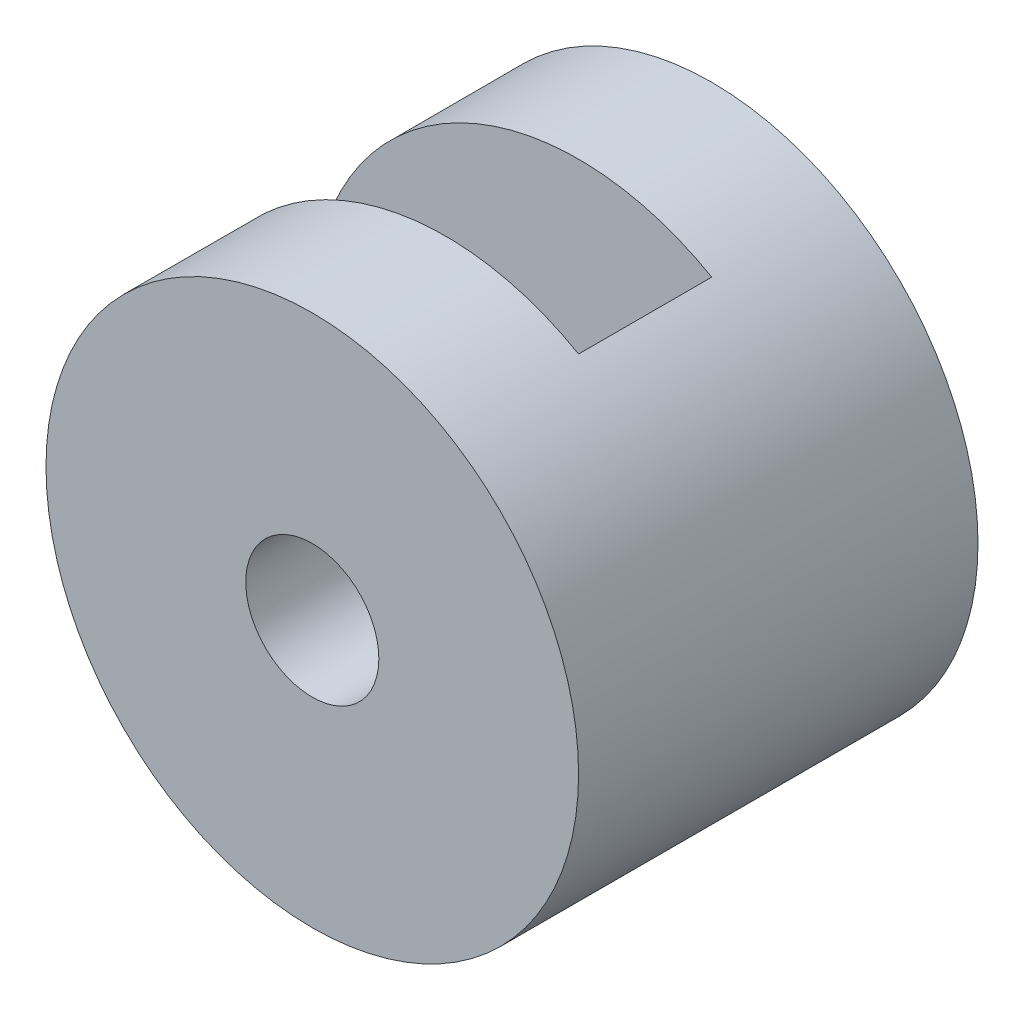
ISO-10303-21;
HEADER;
FILE_DESCRIPTION(('STEP AP214'),'2;1');
FILE_NAME('part.step','',(''),(''),'','','');
FILE_SCHEMA(('AUTOMOTIVE_DESIGN { 1 0 10303 214 1 1 1 1 }'));
ENDSEC;
DATA;
#1=APPLICATION_CONTEXT('core data for automotive mechanical design processes');
#2=APPLICATION_PROTOCOL_DEFINITION('international standard','automotive_design',2000,#1);
#3=PRODUCT_CONTEXT('',#1,'mechanical');
#4=PRODUCT('Part','Part','',(#3));
#5=PRODUCT_RELATED_PRODUCT_CATEGORY('part','',(#4));
#6=PRODUCT_DEFINITION_FORMATION('','',#4);
#7=PRODUCT_DEFINITION_CONTEXT('part definition',#1,'design');
#8=PRODUCT_DEFINITION('design','',#6,#7);
#9=PRODUCT_DEFINITION_SHAPE('','',#8);
#10=(LENGTH_UNIT() NAMED_UNIT(*) SI_UNIT(.MILLI.,.METRE.));
#11=(NAMED_UNIT(*) PLANE_ANGLE_UNIT() SI_UNIT($,.RADIAN.));
#12=(NAMED_UNIT(*) SI_UNIT($,.STERADIAN.) SOLID_ANGLE_UNIT());
#13=UNCERTAINTY_MEASURE_WITH_UNIT(LENGTH_MEASURE(1.E-05),#10,'distance_accuracy_value','');
#14=(GEOMETRIC_REPRESENTATION_CONTEXT(3) GLOBAL_UNCERTAINTY_ASSIGNED_CONTEXT((#13)) GLOBAL_UNIT_ASSIGNED_CONTEXT((#10,
#11,#12)) REPRESENTATION_CONTEXT('',''));
#15=CARTESIAN_POINT('',(0.,0.,0.));
#16=DIRECTION('',(0.,0.,1.));
#17=DIRECTION('',(1.,0.,0.));
#18=AXIS2_PLACEMENT_3D('',#15,#16,#17);
#19=CARTESIAN_POINT('',(0.,0.,-5.));
#20=DIRECTION('',(0.,0.,1.));
#21=DIRECTION('',(1.,0.,0.));
#22=AXIS2_PLACEMENT_3D('',#19,#20,#21);
#23=CYLINDRICAL_SURFACE('',#22,10.);
#24=CARTESIAN_POINT('',(0.,0.,5.));
#25=DIRECTION('',(0.,0.,1.));
#26=DIRECTION('',(1.,0.,0.));
#27=AXIS2_PLACEMENT_3D('',#24,#25,#26);
#28=CIRCLE('',#27,10.);
#29=CARTESIAN_POINT('',(0.,-10.,5.));
#30=VERTEX_POINT('',#29);
#31=CARTESIAN_POINT('',(10.,0.,5.));
#32=VERTEX_POINT('',#31);
#33=EDGE_CURVE('E100',#30,#32,#28,.T.);
#34=ORIENTED_EDGE('',*,*,#33,.T.);
#35=DIRECTION('',(0.,0.,1.));
#36=VECTOR('',#35,1.);
#37=CARTESIAN_POINT('',(10.,0.,-5.));
#38=LINE('',#37,#36);
#39=CARTESIAN_POINT('',(10.,0.,-5.));
#40=VERTEX_POINT('',#39);
#41=EDGE_CURVE('E88',#40,#32,#38,.T.);
#42=ORIENTED_EDGE('',*,*,#41,.F.);
#43=CARTESIAN_POINT('',(0.,0.,-5.));
#44=DIRECTION('',(0.,0.,1.));
#45=DIRECTION('',(1.,0.,0.));
#46=AXIS2_PLACEMENT_3D('',#43,#44,#45);
#47=CIRCLE('',#46,10.);
#48=CARTESIAN_POINT('',(0.,-10.,-5.));
#49=VERTEX_POINT('',#48);
#50=EDGE_CURVE('E92',#49,#40,#47,.T.);
#51=ORIENTED_EDGE('',*,*,#50,.F.);
#52=DIRECTION('',(0.,0.,-1.));
#53=VECTOR('',#52,1.);
#54=CARTESIAN_POINT('',(0.,-10.,-5.));
#55=LINE('',#54,#53);
#56=EDGE_CURVE('E168',#30,#49,#55,.T.);
#57=ORIENTED_EDGE('',*,*,#56,.F.);
#58=EDGE_LOOP('',(#34,#42,#51,#57));
#59=FACE_BOUND('',#58,.T.);
#60=ADVANCED_FACE('F39',(#59),#23,.F.);
#61=CARTESIAN_POINT('',(0.,0.,15.));
#62=DIRECTION('',(0.,0.,-1.));
#63=DIRECTION('',(-1.,0.,0.));
#64=AXIS2_PLACEMENT_3D('',#61,#62,#63);
#65=CYLINDRICAL_SURFACE('',#64,5.);
#66=CARTESIAN_POINT('',(0.,0.,-15.));
#67=DIRECTION('',(0.,0.,1.));
#68=DIRECTION('',(1.,0.,0.));
#69=AXIS2_PLACEMENT_3D('',#66,#67,#68);
#70=CIRCLE('',#69,5.);
#71=CARTESIAN_POINT('',(5.,0.,-15.));
#72=VERTEX_POINT('',#71);
#73=EDGE_CURVE('E114',#72,#72,#70,.T.);
#74=ORIENTED_EDGE('',*,*,#73,.F.);
#75=EDGE_LOOP('',(#74));
#76=FACE_BOUND('',#75,.T.);
#77=CARTESIAN_POINT('',(0.,0.,-5.));
#78=DIRECTION('',(0.,0.,1.));
#79=DIRECTION('',(1.,0.,0.));
#80=AXIS2_PLACEMENT_3D('',#77,#78,#79);
#81=CIRCLE('',#80,5.);
#82=CARTESIAN_POINT('',(5.,0.,-5.));
#83=VERTEX_POINT('',#82);
#84=EDGE_CURVE('E43',#83,#83,#81,.T.);
#85=ORIENTED_EDGE('',*,*,#84,.T.);
#86=EDGE_LOOP('',(#85));
#87=FACE_BOUND('',#86,.T.);
#88=ADVANCED_FACE('F127',(#76,#87),#65,.F.);
#89=CARTESIAN_POINT('',(0.,0.,15.));
#90=DIRECTION('',(0.,0.,1.));
#91=DIRECTION('',(1.,0.,0.));
#92=AXIS2_PLACEMENT_3D('',#89,#90,#91);
#93=PLANE('',#92);
#94=CARTESIAN_POINT('',(0.,0.,15.));
#95=DIRECTION('',(0.,0.,1.));
#96=DIRECTION('',(1.,0.,0.));
#97=AXIS2_PLACEMENT_3D('',#94,#95,#96);
#98=CIRCLE('',#97,20.);
#99=CARTESIAN_POINT('',(20.,0.,15.));
#100=VERTEX_POINT('',#99);
#101=EDGE_CURVE('E11',#100,#100,#98,.T.);
#102=ORIENTED_EDGE('',*,*,#101,.T.);
#103=EDGE_LOOP('',(#102));
#104=FACE_BOUND('',#103,.T.);
#105=CARTESIAN_POINT('',(0.,0.,15.));
#106=DIRECTION('',(0.,0.,1.));
#107=DIRECTION('',(1.,0.,0.));
#108=AXIS2_PLACEMENT_3D('',#105,#106,#107);
#109=CIRCLE('',#108,5.);
#110=CARTESIAN_POINT('',(5.,0.,15.));
#111=VERTEX_POINT('',#110);
#112=EDGE_CURVE('E109',#111,#111,#109,.T.);
#113=ORIENTED_EDGE('',*,*,#112,.F.);
#114=EDGE_LOOP('',(#113));
#115=FACE_BOUND('',#114,.T.);
#116=ADVANCED_FACE('F121',(#104,#115),#93,.T.);
#117=CARTESIAN_POINT('',(0.,0.,-15.));
#118=DIRECTION('',(0.,0.,1.));
#119=DIRECTION('',(1.,0.,0.));
#120=AXIS2_PLACEMENT_3D('',#117,#118,#119);
#121=PLANE('',#120);
#122=CARTESIAN_POINT('',(0.,0.,-15.));
#123=DIRECTION('',(0.,0.,1.));
#124=DIRECTION('',(1.,0.,0.));
#125=AXIS2_PLACEMENT_3D('',#122,#123,#124);
#126=CIRCLE('',#125,20.);
#127=CARTESIAN_POINT('',(20.,0.,-15.));
#128=VERTEX_POINT('',#127);
#129=EDGE_CURVE('E48',#128,#128,#126,.T.);
#130=ORIENTED_EDGE('',*,*,#129,.F.);
#131=EDGE_LOOP('',(#130));
#132=FACE_BOUND('',#131,.T.);
#133=ORIENTED_EDGE('',*,*,#73,.T.);
#134=EDGE_LOOP('',(#133));
#135=FACE_BOUND('',#134,.T.);
#136=ADVANCED_FACE('F116',(#132,#135),#121,.F.);
#137=CARTESIAN_POINT('',(0.,0.,15.));
#138=DIRECTION('',(0.,0.,-1.));
#139=DIRECTION('',(-1.,0.,0.));
#140=AXIS2_PLACEMENT_3D('',#137,#138,#139);
#141=CYLINDRICAL_SURFACE('',#140,20.);
#142=CARTESIAN_POINT('',(0.,0.,-5.));
#143=DIRECTION('',(0.,0.,-1.));
#144=DIRECTION('',(0.,1.,0.));
#145=AXIS2_PLACEMENT_3D('',#142,#143,#144);
#146=CIRCLE('',#145,20.);
#147=CARTESIAN_POINT('',(-17.3205080756888,-10.,-5.));
#148=VERTEX_POINT('',#147);
#149=CARTESIAN_POINT('',(10.,17.3205080756888,-5.));
#150=VERTEX_POINT('',#149);
#151=EDGE_CURVE('E65',#148,#150,#146,.T.);
#152=ORIENTED_EDGE('',*,*,#151,.T.);
#153=DIRECTION('',(0.,0.,-1.));
#154=VECTOR('',#153,1.);
#155=CARTESIAN_POINT('',(10.,17.3205080756888,15.));
#156=LINE('',#155,#154);
#157=CARTESIAN_POINT('',(10.,17.3205080756888,5.));
#158=VERTEX_POINT('',#157);
#159=EDGE_CURVE('E90',#158,#150,#156,.T.);
#160=ORIENTED_EDGE('',*,*,#159,.F.);
#161=CARTESIAN_POINT('',(0.,0.,5.));
#162=DIRECTION('',(0.,0.,1.));
#163=DIRECTION('',(0.,-1.,0.));
#164=AXIS2_PLACEMENT_3D('',#161,#162,#163);
#165=CIRCLE('',#164,20.);
#166=CARTESIAN_POINT('',(-17.3205080756888,-10.,5.));
#167=VERTEX_POINT('',#166);
#168=EDGE_CURVE('E57',#158,#167,#165,.T.);
#169=ORIENTED_EDGE('',*,*,#168,.T.);
#170=DIRECTION('',(0.,0.,-1.));
#171=VECTOR('',#170,1.);
#172=CARTESIAN_POINT('',(-17.3205080756888,-10.,15.));
#173=LINE('',#172,#171);
#174=EDGE_CURVE('E164',#167,#148,#173,.T.);
#175=ORIENTED_EDGE('',*,*,#174,.T.);
#176=EDGE_LOOP('',(#152,#160,#169,#175));
#177=FACE_BOUND('',#176,.T.);
#178=ORIENTED_EDGE('',*,*,#101,.F.);
#179=EDGE_LOOP('',(#178));
#180=FACE_BOUND('',#179,.T.);
#181=ORIENTED_EDGE('',*,*,#129,.T.);
#182=EDGE_LOOP('',(#181));
#183=FACE_BOUND('',#182,.T.);
#184=ADVANCED_FACE('F41',(#177,#180,#183),#141,.T.);
#185=CARTESIAN_POINT('',(0.,0.,5.));
#186=DIRECTION('',(0.,0.,1.));
#187=DIRECTION('',(1.,0.,0.));
#188=AXIS2_PLACEMENT_3D('',#185,#186,#187);
#189=CIRCLE('',#188,5.);
#190=CARTESIAN_POINT('',(5.,0.,5.));
#191=VERTEX_POINT('',#190);
#192=EDGE_CURVE('E103',#191,#191,#189,.T.);
#193=ORIENTED_EDGE('',*,*,#192,.F.);
#194=EDGE_LOOP('',(#193));
#195=FACE_BOUND('',#194,.T.);
#196=ORIENTED_EDGE('',*,*,#112,.T.);
#197=EDGE_LOOP('',(#196));
#198=FACE_BOUND('',#197,.T.);
#199=ADVANCED_FACE('F128',(#195,#198),#65,.F.);
#200=CARTESIAN_POINT('',(0.,0.,-5.));
#201=DIRECTION('',(0.,0.,1.));
#202=DIRECTION('',(1.,0.,0.));
#203=AXIS2_PLACEMENT_3D('',#200,#201,#202);
#204=PLANE('',#203);
#205=ORIENTED_EDGE('',*,*,#84,.F.);
#206=EDGE_LOOP('',(#205));
#207=FACE_BOUND('',#206,.T.);
#208=ORIENTED_EDGE('',*,*,#50,.T.);
#209=DIRECTION('',(0.,-1.,0.));
#210=VECTOR('',#209,1.);
#211=CARTESIAN_POINT('',(10.,20.,-5.));
#212=LINE('',#211,#210);
#213=EDGE_CURVE('E81',#150,#40,#212,.T.);
#214=ORIENTED_EDGE('',*,*,#213,.F.);
#215=ORIENTED_EDGE('',*,*,#151,.F.);
#216=DIRECTION('',(1.,0.,0.));
#217=VECTOR('',#216,1.);
#218=CARTESIAN_POINT('',(-36.,-10.,-5.));
#219=LINE('',#218,#217);
#220=EDGE_CURVE('E101',#148,#49,#219,.T.);
#221=ORIENTED_EDGE('',*,*,#220,.T.);
#222=EDGE_LOOP('',(#208,#214,#215,#221));
#223=FACE_BOUND('',#222,.T.);
#224=ADVANCED_FACE('F99',(#207,#223),#204,.T.);
#225=CARTESIAN_POINT('',(0.,0.,5.));
#226=DIRECTION('',(0.,0.,1.));
#227=DIRECTION('',(1.,0.,0.));
#228=AXIS2_PLACEMENT_3D('',#225,#226,#227);
#229=PLANE('',#228);
#230=DIRECTION('',(0.,1.,0.));
#231=VECTOR('',#230,1.);
#232=CARTESIAN_POINT('',(10.,20.,5.));
#233=LINE('',#232,#231);
#234=EDGE_CURVE('E98',#32,#158,#233,.T.);
#235=ORIENTED_EDGE('',*,*,#234,.F.);
#236=ORIENTED_EDGE('',*,*,#33,.F.);
#237=DIRECTION('',(1.,0.,0.));
#238=VECTOR('',#237,1.);
#239=CARTESIAN_POINT('',(-36.,-10.,5.));
#240=LINE('',#239,#238);
#241=EDGE_CURVE('E169',#167,#30,#240,.T.);
#242=ORIENTED_EDGE('',*,*,#241,.F.);
#243=ORIENTED_EDGE('',*,*,#168,.F.);
#244=EDGE_LOOP('',(#235,#236,#242,#243));
#245=FACE_BOUND('',#244,.T.);
#246=ORIENTED_EDGE('',*,*,#192,.T.);
#247=EDGE_LOOP('',(#246));
#248=FACE_BOUND('',#247,.T.);
#249=ADVANCED_FACE('F131',(#245,#248),#229,.F.);
#250=CARTESIAN_POINT('',(-36.,-10.,-5.));
#251=DIRECTION('',(0.,-1.,0.));
#252=DIRECTION('',(0.,0.,-1.));
#253=AXIS2_PLACEMENT_3D('',#250,#251,#252);
#254=PLANE('',#253);
#255=ORIENTED_EDGE('',*,*,#241,.T.);
#256=ORIENTED_EDGE('',*,*,#56,.T.);
#257=ORIENTED_EDGE('',*,*,#220,.F.);
#258=ORIENTED_EDGE('',*,*,#174,.F.);
#259=EDGE_LOOP('',(#255,#256,#257,#258));
#260=FACE_BOUND('',#259,.T.);
#261=ADVANCED_FACE('F143',(#260),#254,.F.);
#262=CARTESIAN_POINT('',(10.,0.,0.));
#263=DIRECTION('',(-1.,0.,0.));
#264=DIRECTION('',(0.,0.,1.));
#265=AXIS2_PLACEMENT_3D('',#262,#263,#264);
#266=PLANE('',#265);
#267=ORIENTED_EDGE('',*,*,#159,.T.);
#268=ORIENTED_EDGE('',*,*,#213,.T.);
#269=ORIENTED_EDGE('',*,*,#41,.T.);
#270=ORIENTED_EDGE('',*,*,#234,.T.);
#271=EDGE_LOOP('',(#267,#268,#269,#270));
#272=FACE_BOUND('',#271,.T.);
#273=ADVANCED_FACE('F84',(#272),#266,.T.);
#274=CLOSED_SHELL('',(#60,#88,#116,#136,#184,#199,#224,#249,#261,#273));
#275=MANIFOLD_SOLID_BREP('B2',#274);
#276=ADVANCED_BREP_SHAPE_REPRESENTATION('',(#18,#275),#14);
#277=SHAPE_DEFINITION_REPRESENTATION(#9,#276);
ENDSEC;
END-ISO-10303-21;
